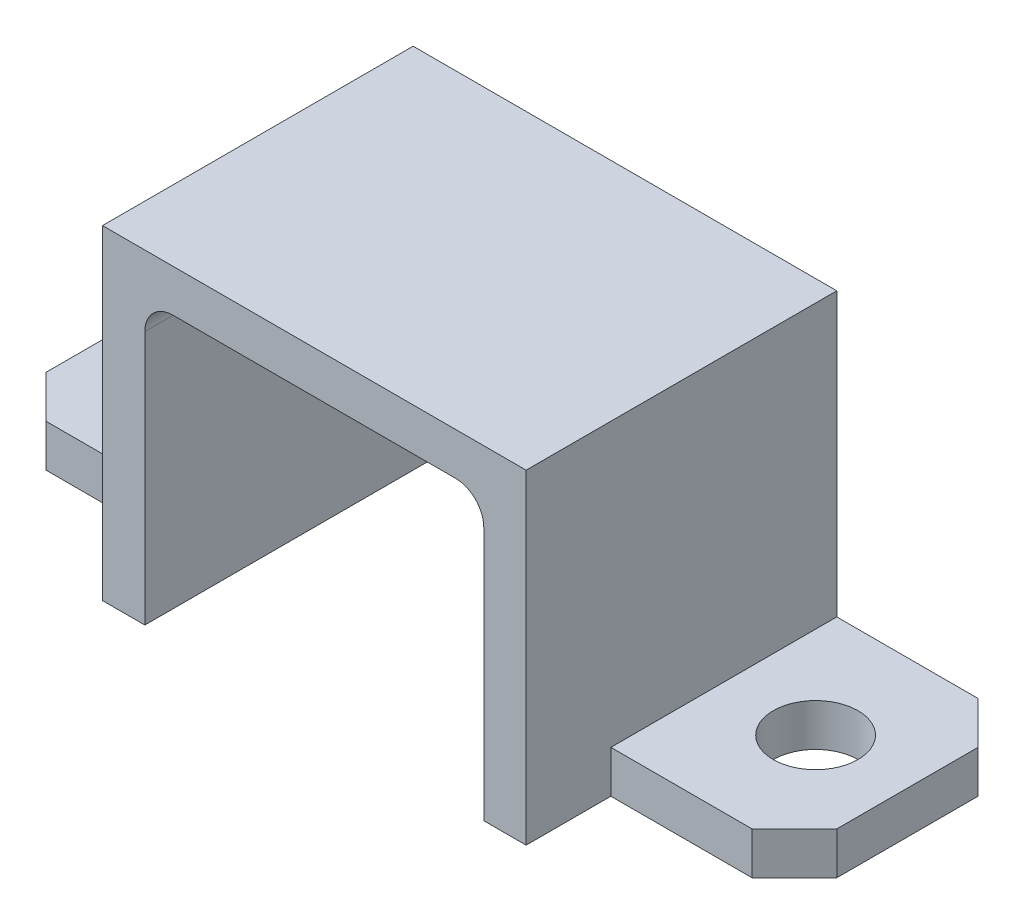
ISO-10303-21;
HEADER;
FILE_DESCRIPTION(('STEP AP214'),'2;1');
FILE_NAME('part.step','',(''),(''),'','','');
FILE_SCHEMA(('AUTOMOTIVE_DESIGN { 1 0 10303 214 1 1 1 1 }'));
ENDSEC;
DATA;
#1=APPLICATION_CONTEXT('core data for automotive mechanical design processes');
#2=APPLICATION_PROTOCOL_DEFINITION('international standard','automotive_design',2000,#1);
#3=PRODUCT_CONTEXT('',#1,'mechanical');
#4=PRODUCT('Part','Part','',(#3));
#5=PRODUCT_RELATED_PRODUCT_CATEGORY('part','',(#4));
#6=PRODUCT_DEFINITION_FORMATION('','',#4);
#7=PRODUCT_DEFINITION_CONTEXT('part definition',#1,'design');
#8=PRODUCT_DEFINITION('design','',#6,#7);
#9=PRODUCT_DEFINITION_SHAPE('','',#8);
#10=(LENGTH_UNIT() NAMED_UNIT(*) SI_UNIT(.MILLI.,.METRE.));
#11=(NAMED_UNIT(*) PLANE_ANGLE_UNIT() SI_UNIT($,.RADIAN.));
#12=(NAMED_UNIT(*) SI_UNIT($,.STERADIAN.) SOLID_ANGLE_UNIT());
#13=UNCERTAINTY_MEASURE_WITH_UNIT(LENGTH_MEASURE(1.E-05),#10,'distance_accuracy_value','');
#14=(GEOMETRIC_REPRESENTATION_CONTEXT(3) GLOBAL_UNCERTAINTY_ASSIGNED_CONTEXT((#13)) GLOBAL_UNIT_ASSIGNED_CONTEXT((#10,
#11,#12)) REPRESENTATION_CONTEXT('',''));
#15=CARTESIAN_POINT('',(0.,0.,0.));
#16=DIRECTION('',(0.,0.,1.));
#17=DIRECTION('',(1.,0.,0.));
#18=AXIS2_PLACEMENT_3D('',#15,#16,#17);
#19=CARTESIAN_POINT('',(22.,0.,11.));
#20=DIRECTION('',(-1.,0.,0.));
#21=DIRECTION('',(0.,0.,1.));
#22=AXIS2_PLACEMENT_3D('',#19,#20,#21);
#23=PLANE('',#22);
#24=DIRECTION('',(0.,0.,-1.));
#25=VECTOR('',#24,1.);
#26=CARTESIAN_POINT('',(22.,0.,11.));
#27=LINE('',#26,#25);
#28=CARTESIAN_POINT('',(22.,0.,6.5));
#29=VERTEX_POINT('',#28);
#30=CARTESIAN_POINT('',(22.,0.,1.5));
#31=VERTEX_POINT('',#30);
#32=EDGE_CURVE('E219',#29,#31,#27,.T.);
#33=ORIENTED_EDGE('',*,*,#32,.T.);
#34=DIRECTION('',(0.,1.,0.));
#35=VECTOR('',#34,1.);
#36=CARTESIAN_POINT('',(22.,0.,1.5));
#37=LINE('',#36,#35);
#38=CARTESIAN_POINT('',(22.,1.5,1.5));
#39=VERTEX_POINT('',#38);
#40=EDGE_CURVE('E358',#31,#39,#37,.T.);
#41=ORIENTED_EDGE('',*,*,#40,.T.);
#42=DIRECTION('',(0.,0.,-1.));
#43=VECTOR('',#42,1.);
#44=CARTESIAN_POINT('',(22.,1.5,11.));
#45=LINE('',#44,#43);
#46=CARTESIAN_POINT('',(22.,1.5,6.5));
#47=VERTEX_POINT('',#46);
#48=EDGE_CURVE('E216',#47,#39,#45,.T.);
#49=ORIENTED_EDGE('',*,*,#48,.F.);
#50=DIRECTION('',(0.,1.,0.));
#51=VECTOR('',#50,1.);
#52=CARTESIAN_POINT('',(22.,0.,6.5));
#53=LINE('',#52,#51);
#54=EDGE_CURVE('E348',#29,#47,#53,.T.);
#55=ORIENTED_EDGE('',*,*,#54,.F.);
#56=EDGE_LOOP('',(#33,#41,#49,#55));
#57=FACE_BOUND('',#56,.T.);
#58=ADVANCED_FACE('F35',(#57),#23,.F.);
#59=CARTESIAN_POINT('',(22.,1.5,11.));
#60=DIRECTION('',(0.,-1.,0.));
#61=DIRECTION('',(1.,0.,0.));
#62=AXIS2_PLACEMENT_3D('',#59,#60,#61);
#63=PLANE('',#62);
#64=CARTESIAN_POINT('',(18.75,1.5,4.));
#65=DIRECTION('',(0.,1.,0.));
#66=DIRECTION('',(1.,0.,0.));
#67=AXIS2_PLACEMENT_3D('',#64,#65,#66);
#68=CIRCLE('',#67,1.5);
#69=CARTESIAN_POINT('',(20.25,1.5,4.));
#70=VERTEX_POINT('',#69);
#71=EDGE_CURVE('E368',#70,#70,#68,.T.);
#72=ORIENTED_EDGE('',*,*,#71,.F.);
#73=EDGE_LOOP('',(#72));
#74=FACE_BOUND('',#73,.T.);
#75=ORIENTED_EDGE('',*,*,#48,.T.);
#76=DIRECTION('',(0.707106781186547,0.,0.707106781186548));
#77=VECTOR('',#76,1.);
#78=CARTESIAN_POINT('',(22.,1.5,1.5));
#79=LINE('',#78,#77);
#80=CARTESIAN_POINT('',(20.5,1.5,0.));
#81=VERTEX_POINT('',#80);
#82=EDGE_CURVE('E353',#81,#39,#79,.T.);
#83=ORIENTED_EDGE('',*,*,#82,.F.);
#84=DIRECTION('',(-1.,0.,0.));
#85=VECTOR('',#84,1.);
#86=CARTESIAN_POINT('',(22.,1.5,0.));
#87=LINE('',#86,#85);
#88=CARTESIAN_POINT('',(15.5,1.5,0.));
#89=VERTEX_POINT('',#88);
#90=EDGE_CURVE('E239',#81,#89,#87,.T.);
#91=ORIENTED_EDGE('',*,*,#90,.T.);
#92=DIRECTION('',(0.,0.,-1.));
#93=VECTOR('',#92,1.);
#94=CARTESIAN_POINT('',(15.5,1.5,11.));
#95=LINE('',#94,#93);
#96=CARTESIAN_POINT('',(15.5,1.5,8.));
#97=VERTEX_POINT('',#96);
#98=EDGE_CURVE('E213',#97,#89,#95,.T.);
#99=ORIENTED_EDGE('',*,*,#98,.F.);
#100=DIRECTION('',(-1.,0.,0.));
#101=VECTOR('',#100,1.);
#102=CARTESIAN_POINT('',(15.5,1.5,8.));
#103=LINE('',#102,#101);
#104=CARTESIAN_POINT('',(20.5,1.5,8.));
#105=VERTEX_POINT('',#104);
#106=EDGE_CURVE('E330',#105,#97,#103,.T.);
#107=ORIENTED_EDGE('',*,*,#106,.F.);
#108=DIRECTION('',(-0.707106781186547,0.,0.707106781186548));
#109=VECTOR('',#108,1.);
#110=CARTESIAN_POINT('',(22.,1.5,6.5));
#111=LINE('',#110,#109);
#112=EDGE_CURVE('E354',#47,#105,#111,.T.);
#113=ORIENTED_EDGE('',*,*,#112,.F.);
#114=EDGE_LOOP('',(#75,#83,#91,#99,#107,#113));
#115=FACE_BOUND('',#114,.T.);
#116=ADVANCED_FACE('F392',(#74,#115),#63,.F.);
#117=CARTESIAN_POINT('',(13.,9.,11.));
#118=DIRECTION('',(0.,0.,-1.));
#119=DIRECTION('',(-1.,0.,0.));
#120=AXIS2_PLACEMENT_3D('',#117,#118,#119);
#121=CYLINDRICAL_SURFACE('',#120,1.);
#122=CARTESIAN_POINT('',(13.,9.,0.));
#123=DIRECTION('',(0.,0.,-1.));
#124=DIRECTION('',(-1.,0.,0.));
#125=AXIS2_PLACEMENT_3D('',#122,#123,#124);
#126=CIRCLE('',#125,1.);
#127=CARTESIAN_POINT('',(13.,10.,0.));
#128=VERTEX_POINT('',#127);
#129=CARTESIAN_POINT('',(14.,9.,0.));
#130=VERTEX_POINT('',#129);
#131=EDGE_CURVE('E243',#128,#130,#126,.T.);
#132=ORIENTED_EDGE('',*,*,#131,.T.);
#133=DIRECTION('',(0.,0.,-1.));
#134=VECTOR('',#133,1.);
#135=CARTESIAN_POINT('',(14.,9.,11.));
#136=LINE('',#135,#134);
#137=CARTESIAN_POINT('',(14.,9.,11.));
#138=VERTEX_POINT('',#137);
#139=EDGE_CURVE('E11',#138,#130,#136,.T.);
#140=ORIENTED_EDGE('',*,*,#139,.F.);
#141=CARTESIAN_POINT('',(13.,9.,11.));
#142=DIRECTION('',(0.,0.,-1.));
#143=DIRECTION('',(-1.,0.,0.));
#144=AXIS2_PLACEMENT_3D('',#141,#142,#143);
#145=CIRCLE('',#144,1.);
#146=CARTESIAN_POINT('',(13.,10.,11.));
#147=VERTEX_POINT('',#146);
#148=EDGE_CURVE('E264',#147,#138,#145,.T.);
#149=ORIENTED_EDGE('',*,*,#148,.F.);
#150=DIRECTION('',(0.,0.,-1.));
#151=VECTOR('',#150,1.);
#152=CARTESIAN_POINT('',(13.,10.,11.));
#153=LINE('',#152,#151);
#154=EDGE_CURVE('E265',#147,#128,#153,.T.);
#155=ORIENTED_EDGE('',*,*,#154,.T.);
#156=EDGE_LOOP('',(#132,#140,#149,#155));
#157=FACE_BOUND('',#156,.T.);
#158=ADVANCED_FACE('F37',(#157),#121,.F.);
#159=CARTESIAN_POINT('',(14.,9.,11.));
#160=DIRECTION('',(1.,0.,0.));
#161=DIRECTION('',(0.,0.,-1.));
#162=AXIS2_PLACEMENT_3D('',#159,#160,#161);
#163=PLANE('',#162);
#164=DIRECTION('',(0.,-1.,0.));
#165=VECTOR('',#164,1.);
#166=CARTESIAN_POINT('',(14.,9.,0.));
#167=LINE('',#166,#165);
#168=CARTESIAN_POINT('',(14.,0.,0.));
#169=VERTEX_POINT('',#168);
#170=EDGE_CURVE('E236',#130,#169,#167,.T.);
#171=ORIENTED_EDGE('',*,*,#170,.T.);
#172=DIRECTION('',(0.,0.,-1.));
#173=VECTOR('',#172,1.);
#174=CARTESIAN_POINT('',(14.,0.,11.));
#175=LINE('',#174,#173);
#176=CARTESIAN_POINT('',(14.,0.,11.));
#177=VERTEX_POINT('',#176);
#178=EDGE_CURVE('E43',#177,#169,#175,.T.);
#179=ORIENTED_EDGE('',*,*,#178,.F.);
#180=DIRECTION('',(0.,-1.,0.));
#181=VECTOR('',#180,1.);
#182=CARTESIAN_POINT('',(14.,9.,11.));
#183=LINE('',#182,#181);
#184=EDGE_CURVE('E294',#138,#177,#183,.T.);
#185=ORIENTED_EDGE('',*,*,#184,.F.);
#186=ORIENTED_EDGE('',*,*,#139,.T.);
#187=EDGE_LOOP('',(#171,#179,#185,#186));
#188=FACE_BOUND('',#187,.T.);
#189=ADVANCED_FACE('F404',(#188),#163,.F.);
#190=CARTESIAN_POINT('',(14.,0.,11.));
#191=DIRECTION('',(0.,1.,0.));
#192=DIRECTION('',(-1.,0.,0.));
#193=AXIS2_PLACEMENT_3D('',#190,#191,#192);
#194=PLANE('',#193);
#195=CARTESIAN_POINT('',(18.75,0.,4.));
#196=DIRECTION('',(0.,1.,0.));
#197=DIRECTION('',(1.,0.,0.));
#198=AXIS2_PLACEMENT_3D('',#195,#196,#197);
#199=CIRCLE('',#198,1.5);
#200=CARTESIAN_POINT('',(20.25,0.,4.));
#201=VERTEX_POINT('',#200);
#202=EDGE_CURVE('E345',#201,#201,#199,.T.);
#203=ORIENTED_EDGE('',*,*,#202,.T.);
#204=EDGE_LOOP('',(#203));
#205=FACE_BOUND('',#204,.T.);
#206=DIRECTION('',(1.,0.,0.));
#207=VECTOR('',#206,1.);
#208=CARTESIAN_POINT('',(14.,0.,0.));
#209=LINE('',#208,#207);
#210=CARTESIAN_POINT('',(20.5,0.,0.));
#211=VERTEX_POINT('',#210);
#212=EDGE_CURVE('E228',#169,#211,#209,.T.);
#213=ORIENTED_EDGE('',*,*,#212,.T.);
#214=DIRECTION('',(0.707106781186547,0.,0.707106781186548));
#215=VECTOR('',#214,1.);
#216=CARTESIAN_POINT('',(22.,0.,1.5));
#217=LINE('',#216,#215);
#218=EDGE_CURVE('E50',#211,#31,#217,.T.);
#219=ORIENTED_EDGE('',*,*,#218,.T.);
#220=ORIENTED_EDGE('',*,*,#32,.F.);
#221=DIRECTION('',(-0.707106781186547,0.,0.707106781186548));
#222=VECTOR('',#221,1.);
#223=CARTESIAN_POINT('',(22.,0.,6.5));
#224=LINE('',#223,#222);
#225=CARTESIAN_POINT('',(20.5,0.,8.));
#226=VERTEX_POINT('',#225);
#227=EDGE_CURVE('E351',#29,#226,#224,.T.);
#228=ORIENTED_EDGE('',*,*,#227,.T.);
#229=DIRECTION('',(1.,0.,0.));
#230=VECTOR('',#229,1.);
#231=CARTESIAN_POINT('',(15.5,0.,8.));
#232=LINE('',#231,#230);
#233=CARTESIAN_POINT('',(15.5,0.,8.));
#234=VERTEX_POINT('',#233);
#235=EDGE_CURVE('E327',#234,#226,#232,.T.);
#236=ORIENTED_EDGE('',*,*,#235,.F.);
#237=DIRECTION('',(0.,0.,1.));
#238=VECTOR('',#237,1.);
#239=CARTESIAN_POINT('',(15.5,0.,8.));
#240=LINE('',#239,#238);
#241=CARTESIAN_POINT('',(15.5,0.,11.));
#242=VERTEX_POINT('',#241);
#243=EDGE_CURVE('E298',#234,#242,#240,.T.);
#244=ORIENTED_EDGE('',*,*,#243,.T.);
#245=DIRECTION('',(1.,0.,0.));
#246=VECTOR('',#245,1.);
#247=CARTESIAN_POINT('',(14.,0.,11.));
#248=LINE('',#247,#246);
#249=EDGE_CURVE('E231',#177,#242,#248,.T.);
#250=ORIENTED_EDGE('',*,*,#249,.F.);
#251=ORIENTED_EDGE('',*,*,#178,.T.);
#252=EDGE_LOOP('',(#213,#219,#220,#228,#236,#244,#250,#251));
#253=FACE_BOUND('',#252,.T.);
#254=ADVANCED_FACE('F227',(#205,#253),#194,.F.);
#255=CARTESIAN_POINT('',(15.5,11.5,11.));
#256=DIRECTION('',(-1.,0.,0.));
#257=DIRECTION('',(0.,-1.,0.));
#258=AXIS2_PLACEMENT_3D('',#255,#256,#257);
#259=PLANE('',#258);
#260=DIRECTION('',(0.,1.,0.));
#261=VECTOR('',#260,1.);
#262=CARTESIAN_POINT('',(15.5,11.5,0.));
#263=LINE('',#262,#261);
#264=CARTESIAN_POINT('',(15.5,11.5,0.));
#265=VERTEX_POINT('',#264);
#266=EDGE_CURVE('E241',#89,#265,#263,.T.);
#267=ORIENTED_EDGE('',*,*,#266,.T.);
#268=DIRECTION('',(0.,0.,-1.));
#269=VECTOR('',#268,1.);
#270=CARTESIAN_POINT('',(15.5,11.5,11.));
#271=LINE('',#270,#269);
#272=CARTESIAN_POINT('',(15.5,11.5,11.));
#273=VERTEX_POINT('',#272);
#274=EDGE_CURVE('E210',#273,#265,#271,.T.);
#275=ORIENTED_EDGE('',*,*,#274,.F.);
#276=DIRECTION('',(0.,1.,0.));
#277=VECTOR('',#276,1.);
#278=CARTESIAN_POINT('',(15.5,11.5,11.));
#279=LINE('',#278,#277);
#280=EDGE_CURVE('E302',#242,#273,#279,.T.);
#281=ORIENTED_EDGE('',*,*,#280,.F.);
#282=ORIENTED_EDGE('',*,*,#243,.F.);
#283=DIRECTION('',(0.,-1.,0.));
#284=VECTOR('',#283,1.);
#285=CARTESIAN_POINT('',(15.5,1.5,8.));
#286=LINE('',#285,#284);
#287=EDGE_CURVE('E324',#97,#234,#286,.T.);
#288=ORIENTED_EDGE('',*,*,#287,.F.);
#289=ORIENTED_EDGE('',*,*,#98,.T.);
#290=EDGE_LOOP('',(#267,#275,#281,#282,#288,#289));
#291=FACE_BOUND('',#290,.T.);
#292=ADVANCED_FACE('F403',(#291),#259,.F.);
#293=CARTESIAN_POINT('',(0.5,11.5,11.));
#294=DIRECTION('',(0.,-1.,0.));
#295=DIRECTION('',(0.,0.,-1.));
#296=AXIS2_PLACEMENT_3D('',#293,#294,#295);
#297=PLANE('',#296);
#298=DIRECTION('',(-1.,0.,0.));
#299=VECTOR('',#298,1.);
#300=CARTESIAN_POINT('',(0.5,11.5,0.));
#301=LINE('',#300,#299);
#302=CARTESIAN_POINT('',(0.5,11.5,0.));
#303=VERTEX_POINT('',#302);
#304=EDGE_CURVE('E248',#265,#303,#301,.T.);
#305=ORIENTED_EDGE('',*,*,#304,.T.);
#306=DIRECTION('',(0.,0.,-1.));
#307=VECTOR('',#306,1.);
#308=CARTESIAN_POINT('',(0.5,11.5,11.));
#309=LINE('',#308,#307);
#310=CARTESIAN_POINT('',(0.5,11.5,11.));
#311=VERTEX_POINT('',#310);
#312=EDGE_CURVE('E207',#311,#303,#309,.T.);
#313=ORIENTED_EDGE('',*,*,#312,.F.);
#314=DIRECTION('',(-1.,0.,0.));
#315=VECTOR('',#314,1.);
#316=CARTESIAN_POINT('',(0.5,11.5,11.));
#317=LINE('',#316,#315);
#318=EDGE_CURVE('E304',#273,#311,#317,.T.);
#319=ORIENTED_EDGE('',*,*,#318,.F.);
#320=ORIENTED_EDGE('',*,*,#274,.T.);
#321=EDGE_LOOP('',(#305,#313,#319,#320));
#322=FACE_BOUND('',#321,.T.);
#323=ADVANCED_FACE('F418',(#322),#297,.F.);
#324=CARTESIAN_POINT('',(0.5,1.5,11.));
#325=DIRECTION('',(1.,0.,0.));
#326=DIRECTION('',(0.,0.,-1.));
#327=AXIS2_PLACEMENT_3D('',#324,#325,#326);
#328=PLANE('',#327);
#329=DIRECTION('',(0.,-1.,0.));
#330=VECTOR('',#329,1.);
#331=CARTESIAN_POINT('',(0.5,1.5,0.));
#332=LINE('',#331,#330);
#333=CARTESIAN_POINT('',(0.5,1.5,0.));
#334=VERTEX_POINT('',#333);
#335=EDGE_CURVE('E250',#303,#334,#332,.T.);
#336=ORIENTED_EDGE('',*,*,#335,.T.);
#337=DIRECTION('',(0.,0.,-1.));
#338=VECTOR('',#337,1.);
#339=CARTESIAN_POINT('',(0.5,1.5,11.));
#340=LINE('',#339,#338);
#341=CARTESIAN_POINT('',(0.5,1.5,8.));
#342=VERTEX_POINT('',#341);
#343=EDGE_CURVE('E199',#342,#334,#340,.T.);
#344=ORIENTED_EDGE('',*,*,#343,.F.);
#345=DIRECTION('',(0.,1.,0.));
#346=VECTOR('',#345,1.);
#347=CARTESIAN_POINT('',(0.5,1.5,8.));
#348=LINE('',#347,#346);
#349=CARTESIAN_POINT('',(0.5,0.,8.));
#350=VERTEX_POINT('',#349);
#351=EDGE_CURVE('E335',#350,#342,#348,.T.);
#352=ORIENTED_EDGE('',*,*,#351,.F.);
#353=DIRECTION('',(0.,0.,1.));
#354=VECTOR('',#353,1.);
#355=CARTESIAN_POINT('',(0.5,0.,8.));
#356=LINE('',#355,#354);
#357=CARTESIAN_POINT('',(0.5,0.,11.));
#358=VERTEX_POINT('',#357);
#359=EDGE_CURVE('E313',#350,#358,#356,.T.);
#360=ORIENTED_EDGE('',*,*,#359,.T.);
#361=DIRECTION('',(0.,-1.,0.));
#362=VECTOR('',#361,1.);
#363=CARTESIAN_POINT('',(0.5,1.5,11.));
#364=LINE('',#363,#362);
#365=EDGE_CURVE('E306',#311,#358,#364,.T.);
#366=ORIENTED_EDGE('',*,*,#365,.F.);
#367=ORIENTED_EDGE('',*,*,#312,.T.);
#368=EDGE_LOOP('',(#336,#344,#352,#360,#366,#367));
#369=FACE_BOUND('',#368,.T.);
#370=ADVANCED_FACE('F420',(#369),#328,.F.);
#371=CARTESIAN_POINT('',(-6.,1.5,11.));
#372=DIRECTION('',(0.,-1.,0.));
#373=DIRECTION('',(1.,0.,0.));
#374=AXIS2_PLACEMENT_3D('',#371,#372,#373);
#375=PLANE('',#374);
#376=CARTESIAN_POINT('',(-2.75,1.5,4.));
#377=DIRECTION('',(0.,1.,0.));
#378=DIRECTION('',(-1.,0.,0.));
#379=AXIS2_PLACEMENT_3D('',#376,#377,#378);
#380=CIRCLE('',#379,1.5);
#381=CARTESIAN_POINT('',(-4.25,1.5,4.));
#382=VERTEX_POINT('',#381);
#383=EDGE_CURVE('E342',#382,#382,#380,.T.);
#384=ORIENTED_EDGE('',*,*,#383,.F.);
#385=EDGE_LOOP('',(#384));
#386=FACE_BOUND('',#385,.T.);
#387=DIRECTION('',(-1.,0.,0.));
#388=VECTOR('',#387,1.);
#389=CARTESIAN_POINT('',(-6.,1.5,0.));
#390=LINE('',#389,#388);
#391=CARTESIAN_POINT('',(-4.5,1.5,0.));
#392=VERTEX_POINT('',#391);
#393=EDGE_CURVE('E253',#334,#392,#390,.T.);
#394=ORIENTED_EDGE('',*,*,#393,.T.);
#395=DIRECTION('',(0.707106781186547,0.,-0.707106781186548));
#396=VECTOR('',#395,1.);
#397=CARTESIAN_POINT('',(-6.,1.5,1.5));
#398=LINE('',#397,#396);
#399=CARTESIAN_POINT('',(-6.,1.5,1.5));
#400=VERTEX_POINT('',#399);
#401=EDGE_CURVE('E58',#400,#392,#398,.T.);
#402=ORIENTED_EDGE('',*,*,#401,.F.);
#403=DIRECTION('',(0.,0.,-1.));
#404=VECTOR('',#403,1.);
#405=CARTESIAN_POINT('',(-6.,1.5,11.));
#406=LINE('',#405,#404);
#407=CARTESIAN_POINT('',(-6.,1.5,6.5));
#408=VERTEX_POINT('',#407);
#409=EDGE_CURVE('E196',#408,#400,#406,.T.);
#410=ORIENTED_EDGE('',*,*,#409,.F.);
#411=DIRECTION('',(-0.707106781186548,0.,-0.707106781186548));
#412=VECTOR('',#411,1.);
#413=CARTESIAN_POINT('',(-6.,1.5,6.5));
#414=LINE('',#413,#412);
#415=CARTESIAN_POINT('',(-4.5,1.5,8.));
#416=VERTEX_POINT('',#415);
#417=EDGE_CURVE('E177',#416,#408,#414,.T.);
#418=ORIENTED_EDGE('',*,*,#417,.F.);
#419=DIRECTION('',(-1.,0.,0.));
#420=VECTOR('',#419,1.);
#421=CARTESIAN_POINT('',(0.5,1.5,8.));
#422=LINE('',#421,#420);
#423=EDGE_CURVE('E320',#342,#416,#422,.T.);
#424=ORIENTED_EDGE('',*,*,#423,.F.);
#425=ORIENTED_EDGE('',*,*,#343,.T.);
#426=EDGE_LOOP('',(#394,#402,#410,#418,#424,#425));
#427=FACE_BOUND('',#426,.T.);
#428=ADVANCED_FACE('F377',(#386,#427),#375,.F.);
#429=CARTESIAN_POINT('',(-6.,0.,11.));
#430=DIRECTION('',(1.,0.,0.));
#431=DIRECTION('',(0.,0.,-1.));
#432=AXIS2_PLACEMENT_3D('',#429,#430,#431);
#433=PLANE('',#432);
#434=ORIENTED_EDGE('',*,*,#409,.T.);
#435=DIRECTION('',(0.,1.,0.));
#436=VECTOR('',#435,1.);
#437=CARTESIAN_POINT('',(-6.,0.,1.5));
#438=LINE('',#437,#436);
#439=CARTESIAN_POINT('',(-6.,0.,1.5));
#440=VERTEX_POINT('',#439);
#441=EDGE_CURVE('E195',#440,#400,#438,.T.);
#442=ORIENTED_EDGE('',*,*,#441,.F.);
#443=DIRECTION('',(0.,0.,-1.));
#444=VECTOR('',#443,1.);
#445=CARTESIAN_POINT('',(-6.,0.,11.));
#446=LINE('',#445,#444);
#447=CARTESIAN_POINT('',(-6.,0.,6.5));
#448=VERTEX_POINT('',#447);
#449=EDGE_CURVE('E189',#448,#440,#446,.T.);
#450=ORIENTED_EDGE('',*,*,#449,.F.);
#451=DIRECTION('',(0.,1.,0.));
#452=VECTOR('',#451,1.);
#453=CARTESIAN_POINT('',(-6.,0.,6.5));
#454=LINE('',#453,#452);
#455=EDGE_CURVE('E171',#448,#408,#454,.T.);
#456=ORIENTED_EDGE('',*,*,#455,.T.);
#457=EDGE_LOOP('',(#434,#442,#450,#456));
#458=FACE_BOUND('',#457,.T.);
#459=ADVANCED_FACE('F194',(#458),#433,.F.);
#460=CARTESIAN_POINT('',(2.,0.,11.));
#461=DIRECTION('',(0.,1.,0.));
#462=DIRECTION('',(-1.,0.,0.));
#463=AXIS2_PLACEMENT_3D('',#460,#461,#462);
#464=PLANE('',#463);
#465=CARTESIAN_POINT('',(-2.75,0.,4.));
#466=DIRECTION('',(0.,1.,0.));
#467=DIRECTION('',(-1.,0.,0.));
#468=AXIS2_PLACEMENT_3D('',#465,#466,#467);
#469=CIRCLE('',#468,1.5);
#470=CARTESIAN_POINT('',(-4.25,0.,4.));
#471=VERTEX_POINT('',#470);
#472=EDGE_CURVE('E328',#471,#471,#469,.T.);
#473=ORIENTED_EDGE('',*,*,#472,.T.);
#474=EDGE_LOOP('',(#473));
#475=FACE_BOUND('',#474,.T.);
#476=ORIENTED_EDGE('',*,*,#449,.T.);
#477=DIRECTION('',(0.707106781186547,0.,-0.707106781186548));
#478=VECTOR('',#477,1.);
#479=CARTESIAN_POINT('',(-6.,0.,1.5));
#480=LINE('',#479,#478);
#481=CARTESIAN_POINT('',(-4.5,0.,0.));
#482=VERTEX_POINT('',#481);
#483=EDGE_CURVE('E366',#440,#482,#480,.T.);
#484=ORIENTED_EDGE('',*,*,#483,.T.);
#485=DIRECTION('',(1.,0.,0.));
#486=VECTOR('',#485,1.);
#487=CARTESIAN_POINT('',(2.,0.,0.));
#488=LINE('',#487,#486);
#489=CARTESIAN_POINT('',(2.,0.,0.));
#490=VERTEX_POINT('',#489);
#491=EDGE_CURVE('E256',#482,#490,#488,.T.);
#492=ORIENTED_EDGE('',*,*,#491,.T.);
#493=DIRECTION('',(0.,0.,-1.));
#494=VECTOR('',#493,1.);
#495=CARTESIAN_POINT('',(2.,0.,11.));
#496=LINE('',#495,#494);
#497=CARTESIAN_POINT('',(2.,0.,11.));
#498=VERTEX_POINT('',#497);
#499=EDGE_CURVE('E197',#498,#490,#496,.T.);
#500=ORIENTED_EDGE('',*,*,#499,.F.);
#501=DIRECTION('',(1.,0.,0.));
#502=VECTOR('',#501,1.);
#503=CARTESIAN_POINT('',(2.,0.,11.));
#504=LINE('',#503,#502);
#505=EDGE_CURVE('E308',#358,#498,#504,.T.);
#506=ORIENTED_EDGE('',*,*,#505,.F.);
#507=ORIENTED_EDGE('',*,*,#359,.F.);
#508=DIRECTION('',(1.,0.,0.));
#509=VECTOR('',#508,1.);
#510=CARTESIAN_POINT('',(0.5,0.,8.));
#511=LINE('',#510,#509);
#512=CARTESIAN_POINT('',(-4.5,0.,8.));
#513=VERTEX_POINT('',#512);
#514=EDGE_CURVE('E191',#513,#350,#511,.T.);
#515=ORIENTED_EDGE('',*,*,#514,.F.);
#516=DIRECTION('',(-0.707106781186548,0.,-0.707106781186548));
#517=VECTOR('',#516,1.);
#518=CARTESIAN_POINT('',(-6.,0.,6.5));
#519=LINE('',#518,#517);
#520=EDGE_CURVE('E174',#513,#448,#519,.T.);
#521=ORIENTED_EDGE('',*,*,#520,.T.);
#522=EDGE_LOOP('',(#476,#484,#492,#500,#506,#507,#515,#521));
#523=FACE_BOUND('',#522,.T.);
#524=ADVANCED_FACE('F187',(#475,#523),#464,.F.);
#525=CARTESIAN_POINT('',(2.,0.,11.));
#526=DIRECTION('',(-1.,0.,0.));
#527=DIRECTION('',(0.,0.,1.));
#528=AXIS2_PLACEMENT_3D('',#525,#526,#527);
#529=PLANE('',#528);
#530=DIRECTION('',(0.,1.,0.));
#531=VECTOR('',#530,1.);
#532=CARTESIAN_POINT('',(2.,0.,0.));
#533=LINE('',#532,#531);
#534=CARTESIAN_POINT('',(2.,9.,0.));
#535=VERTEX_POINT('',#534);
#536=EDGE_CURVE('E258',#490,#535,#533,.T.);
#537=ORIENTED_EDGE('',*,*,#536,.T.);
#538=DIRECTION('',(0.,0.,-1.));
#539=VECTOR('',#538,1.);
#540=CARTESIAN_POINT('',(2.,9.,11.));
#541=LINE('',#540,#539);
#542=CARTESIAN_POINT('',(2.,9.,11.));
#543=VERTEX_POINT('',#542);
#544=EDGE_CURVE('E202',#543,#535,#541,.T.);
#545=ORIENTED_EDGE('',*,*,#544,.F.);
#546=DIRECTION('',(0.,1.,0.));
#547=VECTOR('',#546,1.);
#548=CARTESIAN_POINT('',(2.,0.,11.));
#549=LINE('',#548,#547);
#550=EDGE_CURVE('E310',#498,#543,#549,.T.);
#551=ORIENTED_EDGE('',*,*,#550,.F.);
#552=ORIENTED_EDGE('',*,*,#499,.T.);
#553=EDGE_LOOP('',(#537,#545,#551,#552));
#554=FACE_BOUND('',#553,.T.);
#555=ADVANCED_FACE('F422',(#554),#529,.F.);
#556=CARTESIAN_POINT('',(3.,9.,11.));
#557=DIRECTION('',(0.,0.,-1.));
#558=DIRECTION('',(-1.,0.,0.));
#559=AXIS2_PLACEMENT_3D('',#556,#557,#558);
#560=CYLINDRICAL_SURFACE('',#559,1.);
#561=CARTESIAN_POINT('',(3.,9.,0.));
#562=DIRECTION('',(0.,0.,-1.));
#563=DIRECTION('',(-1.,0.,0.));
#564=AXIS2_PLACEMENT_3D('',#561,#562,#563);
#565=CIRCLE('',#564,1.);
#566=CARTESIAN_POINT('',(3.,10.,0.));
#567=VERTEX_POINT('',#566);
#568=EDGE_CURVE('E260',#535,#567,#565,.T.);
#569=ORIENTED_EDGE('',*,*,#568,.T.);
#570=DIRECTION('',(0.,0.,-1.));
#571=VECTOR('',#570,1.);
#572=CARTESIAN_POINT('',(3.,10.,11.));
#573=LINE('',#572,#571);
#574=CARTESIAN_POINT('',(3.,10.,11.));
#575=VERTEX_POINT('',#574);
#576=EDGE_CURVE('E268',#575,#567,#573,.T.);
#577=ORIENTED_EDGE('',*,*,#576,.F.);
#578=CARTESIAN_POINT('',(3.,9.,11.));
#579=DIRECTION('',(0.,0.,-1.));
#580=DIRECTION('',(-1.,0.,0.));
#581=AXIS2_PLACEMENT_3D('',#578,#579,#580);
#582=CIRCLE('',#581,1.);
#583=EDGE_CURVE('E278',#543,#575,#582,.T.);
#584=ORIENTED_EDGE('',*,*,#583,.F.);
#585=ORIENTED_EDGE('',*,*,#544,.T.);
#586=EDGE_LOOP('',(#569,#577,#584,#585));
#587=FACE_BOUND('',#586,.T.);
#588=ADVANCED_FACE('F276',(#587),#560,.F.);
#589=CARTESIAN_POINT('',(3.,10.,11.));
#590=DIRECTION('',(0.,1.,0.));
#591=DIRECTION('',(0.,0.,1.));
#592=AXIS2_PLACEMENT_3D('',#589,#590,#591);
#593=PLANE('',#592);
#594=DIRECTION('',(1.,0.,0.));
#595=VECTOR('',#594,1.);
#596=CARTESIAN_POINT('',(3.,10.,0.));
#597=LINE('',#596,#595);
#598=EDGE_CURVE('E262',#567,#128,#597,.T.);
#599=ORIENTED_EDGE('',*,*,#598,.T.);
#600=ORIENTED_EDGE('',*,*,#154,.F.);
#601=DIRECTION('',(1.,0.,0.));
#602=VECTOR('',#601,1.);
#603=CARTESIAN_POINT('',(3.,10.,11.));
#604=LINE('',#603,#602);
#605=EDGE_CURVE('E269',#575,#147,#604,.T.);
#606=ORIENTED_EDGE('',*,*,#605,.F.);
#607=ORIENTED_EDGE('',*,*,#576,.T.);
#608=EDGE_LOOP('',(#599,#600,#606,#607));
#609=FACE_BOUND('',#608,.T.);
#610=ADVANCED_FACE('F287',(#609),#593,.F.);
#611=CARTESIAN_POINT('',(13.,9.,11.));
#612=DIRECTION('',(0.,0.,-1.));
#613=DIRECTION('',(-1.,0.,0.));
#614=AXIS2_PLACEMENT_3D('',#611,#612,#613);
#615=PLANE('',#614);
#616=ORIENTED_EDGE('',*,*,#365,.T.);
#617=ORIENTED_EDGE('',*,*,#505,.T.);
#618=ORIENTED_EDGE('',*,*,#550,.T.);
#619=ORIENTED_EDGE('',*,*,#583,.T.);
#620=ORIENTED_EDGE('',*,*,#605,.T.);
#621=ORIENTED_EDGE('',*,*,#148,.T.);
#622=ORIENTED_EDGE('',*,*,#184,.T.);
#623=ORIENTED_EDGE('',*,*,#249,.T.);
#624=ORIENTED_EDGE('',*,*,#280,.T.);
#625=ORIENTED_EDGE('',*,*,#318,.T.);
#626=EDGE_LOOP('',(#616,#617,#618,#619,#620,#621,#622,#623,#624,#625));
#627=FACE_BOUND('',#626,.T.);
#628=ADVANCED_FACE('F410',(#627),#615,.F.);
#629=CARTESIAN_POINT('',(13.,9.,0.));
#630=DIRECTION('',(0.,0.,-1.));
#631=DIRECTION('',(-1.,0.,0.));
#632=AXIS2_PLACEMENT_3D('',#629,#630,#631);
#633=PLANE('',#632);
#634=DIRECTION('',(0.,1.,0.));
#635=VECTOR('',#634,1.);
#636=CARTESIAN_POINT('',(-4.5,0.,0.));
#637=LINE('',#636,#635);
#638=EDGE_CURVE('E365',#482,#392,#637,.T.);
#639=ORIENTED_EDGE('',*,*,#638,.T.);
#640=ORIENTED_EDGE('',*,*,#393,.F.);
#641=ORIENTED_EDGE('',*,*,#335,.F.);
#642=ORIENTED_EDGE('',*,*,#304,.F.);
#643=ORIENTED_EDGE('',*,*,#266,.F.);
#644=ORIENTED_EDGE('',*,*,#90,.F.);
#645=DIRECTION('',(0.,1.,0.));
#646=VECTOR('',#645,1.);
#647=CARTESIAN_POINT('',(20.5,0.,0.));
#648=LINE('',#647,#646);
#649=EDGE_CURVE('E238',#211,#81,#648,.T.);
#650=ORIENTED_EDGE('',*,*,#649,.F.);
#651=ORIENTED_EDGE('',*,*,#212,.F.);
#652=ORIENTED_EDGE('',*,*,#170,.F.);
#653=ORIENTED_EDGE('',*,*,#131,.F.);
#654=ORIENTED_EDGE('',*,*,#598,.F.);
#655=ORIENTED_EDGE('',*,*,#568,.F.);
#656=ORIENTED_EDGE('',*,*,#536,.F.);
#657=ORIENTED_EDGE('',*,*,#491,.F.);
#658=EDGE_LOOP('',(#639,#640,#641,#642,#643,#644,#650,#651,#652,#653,#654,#655,#656,#657));
#659=FACE_BOUND('',#658,.T.);
#660=ADVANCED_FACE('F234',(#659),#633,.T.);
#661=CARTESIAN_POINT('',(0.,0.,8.));
#662=DIRECTION('',(0.,0.,1.));
#663=DIRECTION('',(1.,0.,0.));
#664=AXIS2_PLACEMENT_3D('',#661,#662,#663);
#665=PLANE('',#664);
#666=DIRECTION('',(0.,1.,0.));
#667=VECTOR('',#666,1.);
#668=CARTESIAN_POINT('',(20.5,0.,8.));
#669=LINE('',#668,#667);
#670=EDGE_CURVE('E350',#226,#105,#669,.T.);
#671=ORIENTED_EDGE('',*,*,#670,.T.);
#672=ORIENTED_EDGE('',*,*,#106,.T.);
#673=ORIENTED_EDGE('',*,*,#287,.T.);
#674=ORIENTED_EDGE('',*,*,#235,.T.);
#675=EDGE_LOOP('',(#671,#672,#673,#674));
#676=FACE_BOUND('',#675,.T.);
#677=ADVANCED_FACE('F381',(#676),#665,.T.);
#678=CARTESIAN_POINT('',(0.,0.,8.));
#679=DIRECTION('',(0.,0.,-1.));
#680=DIRECTION('',(-1.,0.,0.));
#681=AXIS2_PLACEMENT_3D('',#678,#679,#680);
#682=PLANE('',#681);
#683=ORIENTED_EDGE('',*,*,#423,.T.);
#684=DIRECTION('',(0.,1.,0.));
#685=VECTOR('',#684,1.);
#686=CARTESIAN_POINT('',(-4.5,0.,8.));
#687=LINE('',#686,#685);
#688=EDGE_CURVE('E182',#513,#416,#687,.T.);
#689=ORIENTED_EDGE('',*,*,#688,.F.);
#690=ORIENTED_EDGE('',*,*,#514,.T.);
#691=ORIENTED_EDGE('',*,*,#351,.T.);
#692=EDGE_LOOP('',(#683,#689,#690,#691));
#693=FACE_BOUND('',#692,.T.);
#694=ADVANCED_FACE('F379',(#693),#682,.F.);
#695=CARTESIAN_POINT('',(-6.,0.,6.5));
#696=DIRECTION('',(0.707106781186548,0.,-0.707106781186548));
#697=DIRECTION('',(-0.707106781186548,0.,-0.707106781186548));
#698=AXIS2_PLACEMENT_3D('',#695,#696,#697);
#699=PLANE('',#698);
#700=ORIENTED_EDGE('',*,*,#417,.T.);
#701=ORIENTED_EDGE('',*,*,#455,.F.);
#702=ORIENTED_EDGE('',*,*,#520,.F.);
#703=ORIENTED_EDGE('',*,*,#688,.T.);
#704=EDGE_LOOP('',(#700,#701,#702,#703));
#705=FACE_BOUND('',#704,.T.);
#706=ADVANCED_FACE('F173',(#705),#699,.F.);
#707=CARTESIAN_POINT('',(22.,0.,6.5));
#708=DIRECTION('',(-0.707106781186548,0.,-0.707106781186547));
#709=DIRECTION('',(-0.707106781186547,0.,0.707106781186548));
#710=AXIS2_PLACEMENT_3D('',#707,#708,#709);
#711=PLANE('',#710);
#712=ORIENTED_EDGE('',*,*,#112,.T.);
#713=ORIENTED_EDGE('',*,*,#670,.F.);
#714=ORIENTED_EDGE('',*,*,#227,.F.);
#715=ORIENTED_EDGE('',*,*,#54,.T.);
#716=EDGE_LOOP('',(#712,#713,#714,#715));
#717=FACE_BOUND('',#716,.T.);
#718=ADVANCED_FACE('F387',(#717),#711,.F.);
#719=CARTESIAN_POINT('',(22.,0.,1.5));
#720=DIRECTION('',(-0.707106781186548,0.,0.707106781186547));
#721=DIRECTION('',(0.707106781186547,0.,0.707106781186548));
#722=AXIS2_PLACEMENT_3D('',#719,#720,#721);
#723=PLANE('',#722);
#724=ORIENTED_EDGE('',*,*,#82,.T.);
#725=ORIENTED_EDGE('',*,*,#40,.F.);
#726=ORIENTED_EDGE('',*,*,#218,.F.);
#727=ORIENTED_EDGE('',*,*,#649,.T.);
#728=EDGE_LOOP('',(#724,#725,#726,#727));
#729=FACE_BOUND('',#728,.T.);
#730=ADVANCED_FACE('F506',(#729),#723,.F.);
#731=CARTESIAN_POINT('',(-6.,0.,1.5));
#732=DIRECTION('',(0.707106781186548,0.,0.707106781186547));
#733=DIRECTION('',(0.707106781186547,0.,-0.707106781186548));
#734=AXIS2_PLACEMENT_3D('',#731,#732,#733);
#735=PLANE('',#734);
#736=ORIENTED_EDGE('',*,*,#401,.T.);
#737=ORIENTED_EDGE('',*,*,#638,.F.);
#738=ORIENTED_EDGE('',*,*,#483,.F.);
#739=ORIENTED_EDGE('',*,*,#441,.T.);
#740=EDGE_LOOP('',(#736,#737,#738,#739));
#741=FACE_BOUND('',#740,.T.);
#742=ADVANCED_FACE('F516',(#741),#735,.F.);
#743=CARTESIAN_POINT('',(-2.75,0.,4.));
#744=DIRECTION('',(0.,1.,0.));
#745=DIRECTION('',(-1.,0.,0.));
#746=AXIS2_PLACEMENT_3D('',#743,#744,#745);
#747=CYLINDRICAL_SURFACE('',#746,1.5);
#748=ORIENTED_EDGE('',*,*,#472,.F.);
#749=EDGE_LOOP('',(#748));
#750=FACE_BOUND('',#749,.T.);
#751=ORIENTED_EDGE('',*,*,#383,.T.);
#752=EDGE_LOOP('',(#751));
#753=FACE_BOUND('',#752,.T.);
#754=ADVANCED_FACE('F525',(#750,#753),#747,.F.);
#755=CARTESIAN_POINT('',(18.75,0.,4.));
#756=DIRECTION('',(0.,1.,0.));
#757=DIRECTION('',(-1.,0.,0.));
#758=AXIS2_PLACEMENT_3D('',#755,#756,#757);
#759=CYLINDRICAL_SURFACE('',#758,1.5);
#760=ORIENTED_EDGE('',*,*,#202,.F.);
#761=EDGE_LOOP('',(#760));
#762=FACE_BOUND('',#761,.T.);
#763=ORIENTED_EDGE('',*,*,#71,.T.);
#764=EDGE_LOOP('',(#763));
#765=FACE_BOUND('',#764,.T.);
#766=ADVANCED_FACE('F534',(#762,#765),#759,.F.);
#767=CLOSED_SHELL('',(#58,#116,#158,#189,#254,#292,#323,#370,#428,#459,#524,#555,#588,#610,#628,
#660,#677,#694,#706,#718,#730,#742,#754,#766));
#768=MANIFOLD_SOLID_BREP('B2',#767);
#769=ADVANCED_BREP_SHAPE_REPRESENTATION('',(#18,#768),#14);
#770=SHAPE_DEFINITION_REPRESENTATION(#9,#769);
ENDSEC;
END-ISO-10303-21;
